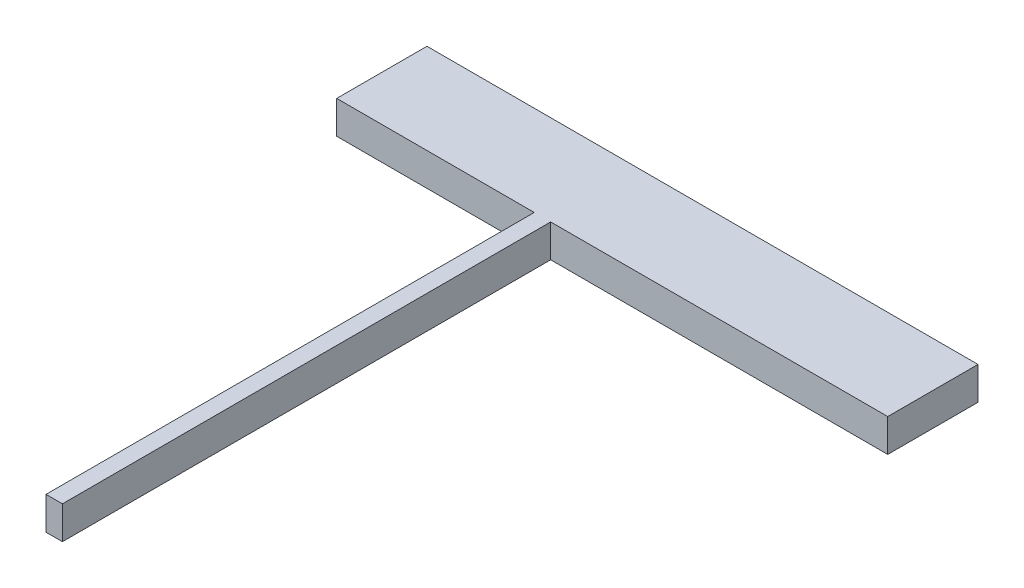
ISO-10303-21;
HEADER;
FILE_DESCRIPTION(('STEP AP214'),'2;1');
FILE_NAME('part.step','',(''),(''),'','','');
FILE_SCHEMA(('AUTOMOTIVE_DESIGN { 1 0 10303 214 1 1 1 1 }'));
ENDSEC;
DATA;
#1=APPLICATION_CONTEXT('core data for automotive mechanical design processes');
#2=APPLICATION_PROTOCOL_DEFINITION('international standard','automotive_design',2000,#1);
#3=PRODUCT_CONTEXT('',#1,'mechanical');
#4=PRODUCT('Part','Part','',(#3));
#5=PRODUCT_RELATED_PRODUCT_CATEGORY('part','',(#4));
#6=PRODUCT_DEFINITION_FORMATION('','',#4);
#7=PRODUCT_DEFINITION_CONTEXT('part definition',#1,'design');
#8=PRODUCT_DEFINITION('design','',#6,#7);
#9=PRODUCT_DEFINITION_SHAPE('','',#8);
#10=(LENGTH_UNIT() NAMED_UNIT(*) SI_UNIT(.MILLI.,.METRE.));
#11=(NAMED_UNIT(*) PLANE_ANGLE_UNIT() SI_UNIT($,.RADIAN.));
#12=(NAMED_UNIT(*) SI_UNIT($,.STERADIAN.) SOLID_ANGLE_UNIT());
#13=UNCERTAINTY_MEASURE_WITH_UNIT(LENGTH_MEASURE(1.E-05),#10,'distance_accuracy_value','');
#14=(GEOMETRIC_REPRESENTATION_CONTEXT(3) GLOBAL_UNCERTAINTY_ASSIGNED_CONTEXT((#13)) GLOBAL_UNIT_ASSIGNED_CONTEXT((#10,
#11,#12)) REPRESENTATION_CONTEXT('',''));
#15=CARTESIAN_POINT('',(0.,0.,0.));
#16=DIRECTION('',(0.,0.,1.));
#17=DIRECTION('',(1.,0.,0.));
#18=AXIS2_PLACEMENT_3D('',#15,#16,#17);
#19=CARTESIAN_POINT('',(-67.15,8.,11.));
#20=DIRECTION('',(0.,0.,-1.));
#21=DIRECTION('',(-1.,0.,0.));
#22=AXIS2_PLACEMENT_3D('',#19,#20,#21);
#23=PLANE('',#22);
#24=DIRECTION('',(0.,1.,0.));
#25=VECTOR('',#24,1.);
#26=CARTESIAN_POINT('',(-15.,8.,11.));
#27=LINE('',#26,#25);
#28=CARTESIAN_POINT('',(-15.,0.,11.));
#29=VERTEX_POINT('',#28);
#30=CARTESIAN_POINT('',(-15.,8.,11.));
#31=VERTEX_POINT('',#30);
#32=EDGE_CURVE('E136',#29,#31,#27,.T.);
#33=ORIENTED_EDGE('',*,*,#32,.F.);
#34=DIRECTION('',(1.,0.,0.));
#35=VECTOR('',#34,1.);
#36=CARTESIAN_POINT('',(-67.15,0.,11.));
#37=LINE('',#36,#35);
#38=CARTESIAN_POINT('',(67.1499999999999,0.,11.));
#39=VERTEX_POINT('',#38);
#40=EDGE_CURVE('E131',#29,#39,#37,.T.);
#41=ORIENTED_EDGE('',*,*,#40,.T.);
#42=DIRECTION('',(0.,-1.,0.));
#43=VECTOR('',#42,1.);
#44=CARTESIAN_POINT('',(67.1499999999999,8.,11.));
#45=LINE('',#44,#43);
#46=CARTESIAN_POINT('',(67.1499999999999,8.,11.));
#47=VERTEX_POINT('',#46);
#48=EDGE_CURVE('E159',#47,#39,#45,.T.);
#49=ORIENTED_EDGE('',*,*,#48,.F.);
#50=DIRECTION('',(1.,0.,0.));
#51=VECTOR('',#50,1.);
#52=CARTESIAN_POINT('',(-67.15,8.,11.));
#53=LINE('',#52,#51);
#54=EDGE_CURVE('E55',#31,#47,#53,.T.);
#55=ORIENTED_EDGE('',*,*,#54,.F.);
#56=EDGE_LOOP('',(#33,#41,#49,#55));
#57=FACE_BOUND('',#56,.T.);
#58=ADVANCED_FACE('F39',(#57),#23,.F.);
#59=DIRECTION('',(0.,-1.,0.));
#60=VECTOR('',#59,1.);
#61=CARTESIAN_POINT('',(-19.,8.00000000000002,11.));
#62=LINE('',#61,#60);
#63=CARTESIAN_POINT('',(-19.,8.,11.));
#64=VERTEX_POINT('',#63);
#65=CARTESIAN_POINT('',(-19.,0.,11.));
#66=VERTEX_POINT('',#65);
#67=EDGE_CURVE('E63',#64,#66,#62,.T.);
#68=ORIENTED_EDGE('',*,*,#67,.F.);
#69=CARTESIAN_POINT('',(-67.15,8.,11.));
#70=VERTEX_POINT('',#69);
#71=EDGE_CURVE('E156',#70,#64,#53,.T.);
#72=ORIENTED_EDGE('',*,*,#71,.F.);
#73=DIRECTION('',(0.,-1.,0.));
#74=VECTOR('',#73,1.);
#75=CARTESIAN_POINT('',(-67.15,8.,11.));
#76=LINE('',#75,#74);
#77=CARTESIAN_POINT('',(-67.15,0.,11.));
#78=VERTEX_POINT('',#77);
#79=EDGE_CURVE('E174',#70,#78,#76,.T.);
#80=ORIENTED_EDGE('',*,*,#79,.T.);
#81=EDGE_CURVE('E150',#78,#66,#37,.T.);
#82=ORIENTED_EDGE('',*,*,#81,.T.);
#83=EDGE_LOOP('',(#68,#72,#80,#82));
#84=FACE_BOUND('',#83,.T.);
#85=ADVANCED_FACE('F188',(#84),#23,.F.);
#86=CARTESIAN_POINT('',(67.15,8.,-11.));
#87=DIRECTION('',(-1.,0.,0.));
#88=DIRECTION('',(0.,0.,1.));
#89=AXIS2_PLACEMENT_3D('',#86,#87,#88);
#90=PLANE('',#89);
#91=DIRECTION('',(0.,0.,-1.));
#92=VECTOR('',#91,1.);
#93=CARTESIAN_POINT('',(67.15,0.,-11.));
#94=LINE('',#93,#92);
#95=CARTESIAN_POINT('',(67.15,0.,-11.));
#96=VERTEX_POINT('',#95);
#97=EDGE_CURVE('E144',#39,#96,#94,.T.);
#98=ORIENTED_EDGE('',*,*,#97,.T.);
#99=DIRECTION('',(0.,-1.,0.));
#100=VECTOR('',#99,1.);
#101=CARTESIAN_POINT('',(67.15,8.,-11.));
#102=LINE('',#101,#100);
#103=CARTESIAN_POINT('',(67.15,8.,-11.));
#104=VERTEX_POINT('',#103);
#105=EDGE_CURVE('E11',#104,#96,#102,.T.);
#106=ORIENTED_EDGE('',*,*,#105,.F.);
#107=DIRECTION('',(0.,0.,-1.));
#108=VECTOR('',#107,1.);
#109=CARTESIAN_POINT('',(67.15,8.,-11.));
#110=LINE('',#109,#108);
#111=EDGE_CURVE('E145',#47,#104,#110,.T.);
#112=ORIENTED_EDGE('',*,*,#111,.F.);
#113=ORIENTED_EDGE('',*,*,#48,.T.);
#114=EDGE_LOOP('',(#98,#106,#112,#113));
#115=FACE_BOUND('',#114,.T.);
#116=ADVANCED_FACE('F41',(#115),#90,.F.);
#117=CARTESIAN_POINT('',(-67.15,8.,-11.));
#118=DIRECTION('',(0.,0.,1.));
#119=DIRECTION('',(1.,0.,0.));
#120=AXIS2_PLACEMENT_3D('',#117,#118,#119);
#121=PLANE('',#120);
#122=DIRECTION('',(-1.,0.,0.));
#123=VECTOR('',#122,1.);
#124=CARTESIAN_POINT('',(-67.15,0.,-11.));
#125=LINE('',#124,#123);
#126=CARTESIAN_POINT('',(-67.15,0.,-11.));
#127=VERTEX_POINT('',#126);
#128=EDGE_CURVE('E163',#96,#127,#125,.T.);
#129=ORIENTED_EDGE('',*,*,#128,.T.);
#130=DIRECTION('',(0.,-1.,0.));
#131=VECTOR('',#130,1.);
#132=CARTESIAN_POINT('',(-67.15,8.,-11.));
#133=LINE('',#132,#131);
#134=CARTESIAN_POINT('',(-67.15,8.,-11.));
#135=VERTEX_POINT('',#134);
#136=EDGE_CURVE('E48',#135,#127,#133,.T.);
#137=ORIENTED_EDGE('',*,*,#136,.F.);
#138=DIRECTION('',(-1.,0.,0.));
#139=VECTOR('',#138,1.);
#140=CARTESIAN_POINT('',(-67.15,8.,-11.));
#141=LINE('',#140,#139);
#142=EDGE_CURVE('E149',#104,#135,#141,.T.);
#143=ORIENTED_EDGE('',*,*,#142,.F.);
#144=ORIENTED_EDGE('',*,*,#105,.T.);
#145=EDGE_LOOP('',(#129,#137,#143,#144));
#146=FACE_BOUND('',#145,.T.);
#147=ADVANCED_FACE('F206',(#146),#121,.F.);
#148=CARTESIAN_POINT('',(-67.15,8.,-11.));
#149=DIRECTION('',(1.,0.,0.));
#150=DIRECTION('',(0.,0.,-1.));
#151=AXIS2_PLACEMENT_3D('',#148,#149,#150);
#152=PLANE('',#151);
#153=DIRECTION('',(0.,0.,1.));
#154=VECTOR('',#153,1.);
#155=CARTESIAN_POINT('',(-67.15,0.,-11.));
#156=LINE('',#155,#154);
#157=EDGE_CURVE('E166',#127,#78,#156,.T.);
#158=ORIENTED_EDGE('',*,*,#157,.T.);
#159=ORIENTED_EDGE('',*,*,#79,.F.);
#160=DIRECTION('',(0.,0.,1.));
#161=VECTOR('',#160,1.);
#162=CARTESIAN_POINT('',(-67.15,8.,-11.));
#163=LINE('',#162,#161);
#164=EDGE_CURVE('E153',#135,#70,#163,.T.);
#165=ORIENTED_EDGE('',*,*,#164,.F.);
#166=ORIENTED_EDGE('',*,*,#136,.T.);
#167=EDGE_LOOP('',(#158,#159,#165,#166));
#168=FACE_BOUND('',#167,.T.);
#169=ADVANCED_FACE('F183',(#168),#152,.F.);
#170=CARTESIAN_POINT('',(0.,8.,0.));
#171=DIRECTION('',(0.,1.,0.));
#172=DIRECTION('',(0.,0.,1.));
#173=AXIS2_PLACEMENT_3D('',#170,#171,#172);
#174=PLANE('',#173);
#175=ORIENTED_EDGE('',*,*,#71,.T.);
#176=DIRECTION('',(0.,0.,-1.));
#177=VECTOR('',#176,1.);
#178=CARTESIAN_POINT('',(-19.,8.,130.));
#179=LINE('',#178,#177);
#180=CARTESIAN_POINT('',(-19.,8.,130.));
#181=VERTEX_POINT('',#180);
#182=EDGE_CURVE('E138',#181,#64,#179,.T.);
#183=ORIENTED_EDGE('',*,*,#182,.F.);
#184=DIRECTION('',(-1.,0.,0.));
#185=VECTOR('',#184,1.);
#186=CARTESIAN_POINT('',(-15.,8.,130.));
#187=LINE('',#186,#185);
#188=CARTESIAN_POINT('',(-15.,8.,130.));
#189=VERTEX_POINT('',#188);
#190=EDGE_CURVE('E116',#189,#181,#187,.T.);
#191=ORIENTED_EDGE('',*,*,#190,.F.);
#192=DIRECTION('',(0.,0.,-1.));
#193=VECTOR('',#192,1.);
#194=CARTESIAN_POINT('',(-15.,8.,130.));
#195=LINE('',#194,#193);
#196=EDGE_CURVE('E112',#189,#31,#195,.T.);
#197=ORIENTED_EDGE('',*,*,#196,.T.);
#198=ORIENTED_EDGE('',*,*,#54,.T.);
#199=ORIENTED_EDGE('',*,*,#111,.T.);
#200=ORIENTED_EDGE('',*,*,#142,.T.);
#201=ORIENTED_EDGE('',*,*,#164,.T.);
#202=EDGE_LOOP('',(#175,#183,#191,#197,#198,#199,#200,#201));
#203=FACE_BOUND('',#202,.T.);
#204=ADVANCED_FACE('F201',(#203),#174,.T.);
#205=CARTESIAN_POINT('',(0.,0.,0.));
#206=DIRECTION('',(0.,1.,0.));
#207=DIRECTION('',(0.,0.,1.));
#208=AXIS2_PLACEMENT_3D('',#205,#206,#207);
#209=PLANE('',#208);
#210=ORIENTED_EDGE('',*,*,#40,.F.);
#211=DIRECTION('',(0.,0.,-1.));
#212=VECTOR('',#211,1.);
#213=CARTESIAN_POINT('',(-15.,0.,130.));
#214=LINE('',#213,#212);
#215=CARTESIAN_POINT('',(-15.,0.,130.));
#216=VERTEX_POINT('',#215);
#217=EDGE_CURVE('E110',#216,#29,#214,.T.);
#218=ORIENTED_EDGE('',*,*,#217,.F.);
#219=DIRECTION('',(1.,0.,0.));
#220=VECTOR('',#219,1.);
#221=CARTESIAN_POINT('',(-19.,0.,130.));
#222=LINE('',#221,#220);
#223=CARTESIAN_POINT('',(-19.,0.,130.));
#224=VERTEX_POINT('',#223);
#225=EDGE_CURVE('E117',#224,#216,#222,.T.);
#226=ORIENTED_EDGE('',*,*,#225,.F.);
#227=DIRECTION('',(0.,0.,-1.));
#228=VECTOR('',#227,1.);
#229=CARTESIAN_POINT('',(-19.,0.,130.));
#230=LINE('',#229,#228);
#231=EDGE_CURVE('E187',#224,#66,#230,.T.);
#232=ORIENTED_EDGE('',*,*,#231,.T.);
#233=ORIENTED_EDGE('',*,*,#81,.F.);
#234=ORIENTED_EDGE('',*,*,#157,.F.);
#235=ORIENTED_EDGE('',*,*,#128,.F.);
#236=ORIENTED_EDGE('',*,*,#97,.F.);
#237=EDGE_LOOP('',(#210,#218,#226,#232,#233,#234,#235,#236));
#238=FACE_BOUND('',#237,.T.);
#239=ADVANCED_FACE('F129',(#238),#209,.F.);
#240=CARTESIAN_POINT('',(-15.,0.,130.));
#241=DIRECTION('',(-1.,0.,0.));
#242=DIRECTION('',(0.,0.,1.));
#243=AXIS2_PLACEMENT_3D('',#240,#241,#242);
#244=PLANE('',#243);
#245=ORIENTED_EDGE('',*,*,#217,.T.);
#246=ORIENTED_EDGE('',*,*,#32,.T.);
#247=ORIENTED_EDGE('',*,*,#196,.F.);
#248=DIRECTION('',(0.,1.,0.));
#249=VECTOR('',#248,1.);
#250=CARTESIAN_POINT('',(-15.,0.,130.));
#251=LINE('',#250,#249);
#252=EDGE_CURVE('E106',#216,#189,#251,.T.);
#253=ORIENTED_EDGE('',*,*,#252,.F.);
#254=EDGE_LOOP('',(#245,#246,#247,#253));
#255=FACE_BOUND('',#254,.T.);
#256=ADVANCED_FACE('F108',(#255),#244,.F.);
#257=CARTESIAN_POINT('',(-19.,8.,130.));
#258=DIRECTION('',(1.,0.,0.));
#259=DIRECTION('',(0.,1.,0.));
#260=AXIS2_PLACEMENT_3D('',#257,#258,#259);
#261=PLANE('',#260);
#262=ORIENTED_EDGE('',*,*,#182,.T.);
#263=ORIENTED_EDGE('',*,*,#67,.T.);
#264=ORIENTED_EDGE('',*,*,#231,.F.);
#265=DIRECTION('',(0.,-1.,0.));
#266=VECTOR('',#265,1.);
#267=CARTESIAN_POINT('',(-19.,8.,130.));
#268=LINE('',#267,#266);
#269=EDGE_CURVE('E122',#181,#224,#268,.T.);
#270=ORIENTED_EDGE('',*,*,#269,.F.);
#271=EDGE_LOOP('',(#262,#263,#264,#270));
#272=FACE_BOUND('',#271,.T.);
#273=ADVANCED_FACE('F191',(#272),#261,.F.);
#274=CARTESIAN_POINT('',(0.,0.,130.));
#275=DIRECTION('',(0.,0.,1.));
#276=DIRECTION('',(1.,0.,0.));
#277=AXIS2_PLACEMENT_3D('',#274,#275,#276);
#278=PLANE('',#277);
#279=ORIENTED_EDGE('',*,*,#225,.T.);
#280=ORIENTED_EDGE('',*,*,#252,.T.);
#281=ORIENTED_EDGE('',*,*,#190,.T.);
#282=ORIENTED_EDGE('',*,*,#269,.T.);
#283=EDGE_LOOP('',(#279,#280,#281,#282));
#284=FACE_BOUND('',#283,.T.);
#285=ADVANCED_FACE('F120',(#284),#278,.T.);
#286=CLOSED_SHELL('',(#58,#85,#116,#147,#169,#204,#239,#256,#273,#285));
#287=MANIFOLD_SOLID_BREP('B2',#286);
#288=ADVANCED_BREP_SHAPE_REPRESENTATION('',(#18,#287),#14);
#289=SHAPE_DEFINITION_REPRESENTATION(#9,#288);
ENDSEC;
END-ISO-10303-21;
